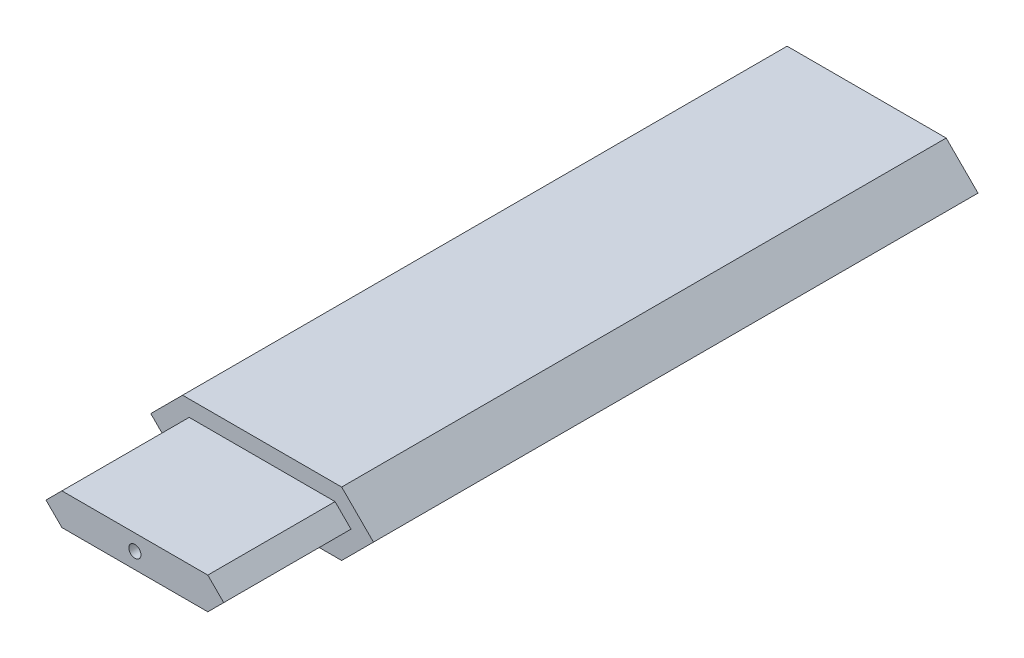
ISO-10303-21;
HEADER;
FILE_DESCRIPTION(('STEP AP214'),'2;1');
FILE_NAME('part.step','',(''),(''),'','','');
FILE_SCHEMA(('AUTOMOTIVE_DESIGN { 1 0 10303 214 1 1 1 1 }'));
ENDSEC;
DATA;
#1=APPLICATION_CONTEXT('core data for automotive mechanical design processes');
#2=APPLICATION_PROTOCOL_DEFINITION('international standard','automotive_design',2000,#1);
#3=PRODUCT_CONTEXT('',#1,'mechanical');
#4=PRODUCT('Part','Part','',(#3));
#5=PRODUCT_RELATED_PRODUCT_CATEGORY('part','',(#4));
#6=PRODUCT_DEFINITION_FORMATION('','',#4);
#7=PRODUCT_DEFINITION_CONTEXT('part definition',#1,'design');
#8=PRODUCT_DEFINITION('design','',#6,#7);
#9=PRODUCT_DEFINITION_SHAPE('','',#8);
#10=(LENGTH_UNIT() NAMED_UNIT(*) SI_UNIT(.MILLI.,.METRE.));
#11=(NAMED_UNIT(*) PLANE_ANGLE_UNIT() SI_UNIT($,.RADIAN.));
#12=(NAMED_UNIT(*) SI_UNIT($,.STERADIAN.) SOLID_ANGLE_UNIT());
#13=UNCERTAINTY_MEASURE_WITH_UNIT(LENGTH_MEASURE(1.E-05),#10,'distance_accuracy_value','');
#14=(GEOMETRIC_REPRESENTATION_CONTEXT(3) GLOBAL_UNCERTAINTY_ASSIGNED_CONTEXT((#13)) GLOBAL_UNIT_ASSIGNED_CONTEXT((#10,
#11,#12)) REPRESENTATION_CONTEXT('',''));
#15=CARTESIAN_POINT('',(0.,0.,0.));
#16=DIRECTION('',(0.,0.,1.));
#17=DIRECTION('',(1.,0.,0.));
#18=AXIS2_PLACEMENT_3D('',#15,#16,#17);
#19=CARTESIAN_POINT('',(0.,0.,-385.0001));
#20=DIRECTION('',(0.,0.,1.));
#21=DIRECTION('',(1.,0.,0.));
#22=AXIS2_PLACEMENT_3D('',#19,#20,#21);
#23=CYLINDRICAL_SURFACE('',#22,1.89999999999996);
#24=CARTESIAN_POINT('',(0.,0.,-155.));
#25=DIRECTION('',(0.,0.,1.));
#26=DIRECTION('',(1.,0.,0.));
#27=AXIS2_PLACEMENT_3D('',#24,#25,#26);
#28=CIRCLE('',#27,1.89999999999996);
#29=CARTESIAN_POINT('',(1.89999999999996,0.,-155.));
#30=VERTEX_POINT('',#29);
#31=EDGE_CURVE('E367',#30,#30,#28,.T.);
#32=ORIENTED_EDGE('',*,*,#31,.T.);
#33=EDGE_LOOP('',(#32));
#34=FACE_BOUND('',#33,.T.);
#35=CARTESIAN_POINT('',(0.,0.,-344.));
#36=DIRECTION('',(0.,0.,-1.));
#37=DIRECTION('',(-1.,0.,0.));
#38=AXIS2_PLACEMENT_3D('',#35,#36,#37);
#39=CIRCLE('',#38,1.89999999999996);
#40=CARTESIAN_POINT('',(-1.89999999999996,0.,-344.));
#41=VERTEX_POINT('',#40);
#42=EDGE_CURVE('E120',#41,#41,#39,.F.);
#43=ORIENTED_EDGE('',*,*,#42,.F.);
#44=EDGE_LOOP('',(#43));
#45=FACE_BOUND('',#44,.T.);
#46=ADVANCED_FACE('F115',(#34,#45),#23,.F.);
#47=CARTESIAN_POINT('',(17.5,-17.5,0.));
#48=DIRECTION('',(0.707106781186548,-0.707106781186547,0.));
#49=DIRECTION('',(-0.707106781186547,-0.707106781186548,0.));
#50=AXIS2_PLACEMENT_3D('',#47,#48,#49);
#51=PLANE('',#50);
#52=DIRECTION('',(0.,0.,-1.));
#53=VECTOR('',#52,1.);
#54=CARTESIAN_POINT('',(35.,0.,0.));
#55=LINE('',#54,#53);
#56=CARTESIAN_POINT('',(35.,0.,-195.));
#57=VERTEX_POINT('',#56);
#58=CARTESIAN_POINT('',(35.,0.,-385.));
#59=VERTEX_POINT('',#58);
#60=EDGE_CURVE('E484',#57,#59,#55,.T.);
#61=ORIENTED_EDGE('',*,*,#60,.F.);
#62=DIRECTION('',(-0.707106781186547,-0.707106781186548,0.));
#63=VECTOR('',#62,1.);
#64=CARTESIAN_POINT('',(17.5,-17.5,-195.));
#65=LINE('',#64,#63);
#66=CARTESIAN_POINT('',(25.,-10.,-195.));
#67=VERTEX_POINT('',#66);
#68=EDGE_CURVE('E357',#57,#67,#65,.T.);
#69=ORIENTED_EDGE('',*,*,#68,.T.);
#70=CARTESIAN_POINT('',(25.,-10.,-195.));
#71=DIRECTION('',(0.,0.,-1.));
#72=VECTOR('',#71,1.);
#73=LINE('',#70,#72);
#74=CARTESIAN_POINT('',(25.,-10.,-385.));
#75=VERTEX_POINT('',#74);
#76=EDGE_CURVE('E395',#67,#75,#73,.T.);
#77=ORIENTED_EDGE('',*,*,#76,.T.);
#78=DIRECTION('',(-0.707106781186547,-0.707106781186548,0.));
#79=VECTOR('',#78,1.);
#80=CARTESIAN_POINT('',(17.5,-17.5,-385.));
#81=LINE('',#80,#79);
#82=EDGE_CURVE('E385',#59,#75,#81,.T.);
#83=ORIENTED_EDGE('',*,*,#82,.F.);
#84=EDGE_LOOP('',(#61,#69,#77,#83));
#85=FACE_BOUND('',#84,.T.);
#86=ADVANCED_FACE('F417',(#85),#51,.T.);
#87=CARTESIAN_POINT('',(-17.5,-17.5,0.));
#88=DIRECTION('',(-0.707106781186548,-0.707106781186547,0.));
#89=DIRECTION('',(-0.707106781186547,0.707106781186548,0.));
#90=AXIS2_PLACEMENT_3D('',#87,#88,#89);
#91=PLANE('',#90);
#92=CARTESIAN_POINT('',(-25.,-10.,-385.));
#93=DIRECTION('',(0.,0.,1.));
#94=VECTOR('',#93,1.);
#95=LINE('',#92,#94);
#96=CARTESIAN_POINT('',(-25.,-10.,-385.));
#97=VERTEX_POINT('',#96);
#98=CARTESIAN_POINT('',(-25.,-10.,-195.));
#99=VERTEX_POINT('',#98);
#100=EDGE_CURVE('E494',#97,#99,#95,.T.);
#101=ORIENTED_EDGE('',*,*,#100,.T.);
#102=DIRECTION('',(-0.707106781186547,0.707106781186548,0.));
#103=VECTOR('',#102,1.);
#104=CARTESIAN_POINT('',(-17.5,-17.5,-195.));
#105=LINE('',#104,#103);
#106=CARTESIAN_POINT('',(-35.,0.,-195.));
#107=VERTEX_POINT('',#106);
#108=EDGE_CURVE('E352',#99,#107,#105,.T.);
#109=ORIENTED_EDGE('',*,*,#108,.T.);
#110=DIRECTION('',(0.,0.,1.));
#111=VECTOR('',#110,1.);
#112=CARTESIAN_POINT('',(-35.,0.,0.));
#113=LINE('',#112,#111);
#114=CARTESIAN_POINT('',(-35.,0.,-385.));
#115=VERTEX_POINT('',#114);
#116=EDGE_CURVE('E486',#115,#107,#113,.T.);
#117=ORIENTED_EDGE('',*,*,#116,.F.);
#118=DIRECTION('',(-0.707106781186547,0.707106781186548,0.));
#119=VECTOR('',#118,1.);
#120=CARTESIAN_POINT('',(-17.5,-17.5,-385.));
#121=LINE('',#120,#119);
#122=EDGE_CURVE('E380',#97,#115,#121,.T.);
#123=ORIENTED_EDGE('',*,*,#122,.F.);
#124=EDGE_LOOP('',(#101,#109,#117,#123));
#125=FACE_BOUND('',#124,.T.);
#126=ADVANCED_FACE('F407',(#125),#91,.T.);
#127=CARTESIAN_POINT('',(0.,-10.,0.));
#128=DIRECTION('',(0.,-1.,0.));
#129=DIRECTION('',(0.,0.,1.));
#130=AXIS2_PLACEMENT_3D('',#127,#128,#129);
#131=PLANE('',#130);
#132=ORIENTED_EDGE('',*,*,#76,.F.);
#133=DIRECTION('',(-1.,0.,0.));
#134=VECTOR('',#133,1.);
#135=CARTESIAN_POINT('',(0.,-10.,-195.));
#136=LINE('',#135,#134);
#137=EDGE_CURVE('E362',#67,#99,#136,.T.);
#138=ORIENTED_EDGE('',*,*,#137,.T.);
#139=ORIENTED_EDGE('',*,*,#100,.F.);
#140=DIRECTION('',(-1.,0.,0.));
#141=VECTOR('',#140,1.);
#142=CARTESIAN_POINT('',(0.,-10.,-385.));
#143=LINE('',#142,#141);
#144=EDGE_CURVE('E390',#75,#97,#143,.T.);
#145=ORIENTED_EDGE('',*,*,#144,.F.);
#146=EDGE_LOOP('',(#132,#138,#139,#145));
#147=FACE_BOUND('',#146,.T.);
#148=ADVANCED_FACE('F416',(#147),#131,.T.);
#149=CARTESIAN_POINT('',(-17.5,17.5,0.));
#150=DIRECTION('',(-0.707106781186548,0.707106781186547,0.));
#151=DIRECTION('',(-0.707106781186547,-0.707106781186548,0.));
#152=AXIS2_PLACEMENT_3D('',#149,#150,#151);
#153=PLANE('',#152);
#154=ORIENTED_EDGE('',*,*,#116,.T.);
#155=DIRECTION('',(0.707106781186547,0.707106781186548,0.));
#156=VECTOR('',#155,1.);
#157=CARTESIAN_POINT('',(-17.5,17.5,-195.));
#158=LINE('',#157,#156);
#159=CARTESIAN_POINT('',(-25.,10.,-195.));
#160=VERTEX_POINT('',#159);
#161=EDGE_CURVE('E347',#107,#160,#158,.T.);
#162=ORIENTED_EDGE('',*,*,#161,.T.);
#163=DIRECTION('',(0.,0.,1.));
#164=VECTOR('',#163,1.);
#165=CARTESIAN_POINT('',(-25.,10.,0.));
#166=LINE('',#165,#164);
#167=CARTESIAN_POINT('',(-25.,10.,-385.));
#168=VERTEX_POINT('',#167);
#169=EDGE_CURVE('E449',#168,#160,#166,.T.);
#170=ORIENTED_EDGE('',*,*,#169,.F.);
#171=DIRECTION('',(0.707106781186547,0.707106781186548,0.));
#172=VECTOR('',#171,1.);
#173=CARTESIAN_POINT('',(-17.5,17.5,-385.));
#174=LINE('',#173,#172);
#175=EDGE_CURVE('E375',#115,#168,#174,.T.);
#176=ORIENTED_EDGE('',*,*,#175,.F.);
#177=EDGE_LOOP('',(#154,#162,#170,#176));
#178=FACE_BOUND('',#177,.T.);
#179=ADVANCED_FACE('F117',(#178),#153,.T.);
#180=CARTESIAN_POINT('',(17.5,17.5,0.));
#181=DIRECTION('',(0.707106781186548,0.707106781186547,0.));
#182=DIRECTION('',(-0.707106781186547,0.707106781186548,0.));
#183=AXIS2_PLACEMENT_3D('',#180,#181,#182);
#184=PLANE('',#183);
#185=DIRECTION('',(0.,0.,-1.));
#186=VECTOR('',#185,1.);
#187=CARTESIAN_POINT('',(25.,10.,0.));
#188=LINE('',#187,#186);
#189=CARTESIAN_POINT('',(25.,10.,-195.));
#190=VERTEX_POINT('',#189);
#191=CARTESIAN_POINT('',(25.,10.,-385.));
#192=VERTEX_POINT('',#191);
#193=EDGE_CURVE('E479',#190,#192,#188,.T.);
#194=ORIENTED_EDGE('',*,*,#193,.F.);
#195=DIRECTION('',(0.707106781186547,-0.707106781186548,0.));
#196=VECTOR('',#195,1.);
#197=CARTESIAN_POINT('',(17.5,17.5,-195.));
#198=LINE('',#197,#196);
#199=EDGE_CURVE('E141',#190,#57,#198,.T.);
#200=ORIENTED_EDGE('',*,*,#199,.T.);
#201=ORIENTED_EDGE('',*,*,#60,.T.);
#202=DIRECTION('',(0.707106781186547,-0.707106781186548,0.));
#203=VECTOR('',#202,1.);
#204=CARTESIAN_POINT('',(17.5,17.5,-385.));
#205=LINE('',#204,#203);
#206=EDGE_CURVE('E372',#192,#59,#205,.T.);
#207=ORIENTED_EDGE('',*,*,#206,.F.);
#208=EDGE_LOOP('',(#194,#200,#201,#207));
#209=FACE_BOUND('',#208,.T.);
#210=ADVANCED_FACE('F425',(#209),#184,.T.);
#211=CARTESIAN_POINT('',(0.,10.,0.));
#212=DIRECTION('',(0.,1.,0.));
#213=DIRECTION('',(0.,0.,1.));
#214=AXIS2_PLACEMENT_3D('',#211,#212,#213);
#215=PLANE('',#214);
#216=ORIENTED_EDGE('',*,*,#169,.T.);
#217=DIRECTION('',(1.,0.,0.));
#218=VECTOR('',#217,1.);
#219=CARTESIAN_POINT('',(0.,10.,-195.));
#220=LINE('',#219,#218);
#221=EDGE_CURVE('E13',#160,#190,#220,.T.);
#222=ORIENTED_EDGE('',*,*,#221,.T.);
#223=ORIENTED_EDGE('',*,*,#193,.T.);
#224=DIRECTION('',(1.,0.,0.));
#225=VECTOR('',#224,1.);
#226=CARTESIAN_POINT('',(0.,10.,-385.));
#227=LINE('',#226,#225);
#228=EDGE_CURVE('E125',#168,#192,#227,.T.);
#229=ORIENTED_EDGE('',*,*,#228,.F.);
#230=EDGE_LOOP('',(#216,#222,#223,#229));
#231=FACE_BOUND('',#230,.T.);
#232=ADVANCED_FACE('F421',(#231),#215,.T.);
#233=CARTESIAN_POINT('',(0.,-22.5001,-155.));
#234=DIRECTION('',(0.,0.,1.));
#235=DIRECTION('',(1.,0.,0.));
#236=AXIS2_PLACEMENT_3D('',#233,#234,#235);
#237=PLANE('',#236);
#238=ORIENTED_EDGE('',*,*,#31,.F.);
#239=EDGE_LOOP('',(#238));
#240=FACE_BOUND('',#239,.T.);
#241=DIRECTION('',(-0.707106781186547,-0.707106781186548,0.));
#242=VECTOR('',#241,1.);
#243=CARTESIAN_POINT('',(-22.9289321881345,5.,-155.));
#244=LINE('',#243,#242);
#245=CARTESIAN_POINT('',(-22.9289321881345,5.,-155.));
#246=VERTEX_POINT('',#245);
#247=CARTESIAN_POINT('',(-27.9289321881345,0.,-155.));
#248=VERTEX_POINT('',#247);
#249=EDGE_CURVE('E301',#246,#248,#244,.T.);
#250=ORIENTED_EDGE('',*,*,#249,.T.);
#251=DIRECTION('',(0.707106781186548,-0.707106781186547,0.));
#252=VECTOR('',#251,1.);
#253=CARTESIAN_POINT('',(-27.9289321881345,0.,-155.));
#254=LINE('',#253,#252);
#255=CARTESIAN_POINT('',(-22.9289321881345,-5.,-155.));
#256=VERTEX_POINT('',#255);
#257=EDGE_CURVE('E317',#248,#256,#254,.T.);
#258=ORIENTED_EDGE('',*,*,#257,.T.);
#259=DIRECTION('',(1.,0.,0.));
#260=VECTOR('',#259,1.);
#261=CARTESIAN_POINT('',(-22.9289321881345,-5.,-155.));
#262=LINE('',#261,#260);
#263=CARTESIAN_POINT('',(22.9289321881345,-5.,-155.));
#264=VERTEX_POINT('',#263);
#265=EDGE_CURVE('E320',#256,#264,#262,.T.);
#266=ORIENTED_EDGE('',*,*,#265,.T.);
#267=DIRECTION('',(0.707106781186547,0.707106781186548,0.));
#268=VECTOR('',#267,1.);
#269=CARTESIAN_POINT('',(22.9289321881345,-5.,-155.));
#270=LINE('',#269,#268);
#271=CARTESIAN_POINT('',(27.9289321881345,0.,-155.));
#272=VERTEX_POINT('',#271);
#273=EDGE_CURVE('E323',#264,#272,#270,.T.);
#274=ORIENTED_EDGE('',*,*,#273,.T.);
#275=DIRECTION('',(-0.707106781186547,0.707106781186548,0.));
#276=VECTOR('',#275,1.);
#277=CARTESIAN_POINT('',(27.9289321881345,0.,-155.));
#278=LINE('',#277,#276);
#279=CARTESIAN_POINT('',(22.9289321881345,5.,-155.));
#280=VERTEX_POINT('',#279);
#281=EDGE_CURVE('E326',#272,#280,#278,.T.);
#282=ORIENTED_EDGE('',*,*,#281,.T.);
#283=DIRECTION('',(-1.,0.,0.));
#284=VECTOR('',#283,1.);
#285=CARTESIAN_POINT('',(22.9289321881345,5.,-155.));
#286=LINE('',#285,#284);
#287=EDGE_CURVE('E329',#280,#246,#286,.T.);
#288=ORIENTED_EDGE('',*,*,#287,.T.);
#289=EDGE_LOOP('',(#250,#258,#266,#274,#282,#288));
#290=FACE_BOUND('',#289,.T.);
#291=ADVANCED_FACE('F424',(#240,#290),#237,.T.);
#292=CARTESIAN_POINT('',(0.,-22.5001,-385.));
#293=DIRECTION('',(0.,0.,1.));
#294=DIRECTION('',(1.,0.,0.));
#295=AXIS2_PLACEMENT_3D('',#292,#293,#294);
#296=PLANE('',#295);
#297=DIRECTION('',(-0.707106781186547,-0.707106781186548,0.));
#298=VECTOR('',#297,1.);
#299=CARTESIAN_POINT('',(28.2117749006092,0.,-385.));
#300=LINE('',#299,#298);
#301=CARTESIAN_POINT('',(28.2117749006092,0.,-385.));
#302=VERTEX_POINT('',#301);
#303=CARTESIAN_POINT('',(23.0117749006092,-5.2,-385.));
#304=VERTEX_POINT('',#303);
#305=EDGE_CURVE('E278',#302,#304,#300,.T.);
#306=ORIENTED_EDGE('',*,*,#305,.F.);
#307=DIRECTION('',(0.707106781186547,-0.707106781186548,0.));
#308=VECTOR('',#307,1.);
#309=CARTESIAN_POINT('',(23.0117749006092,5.2,-385.));
#310=LINE('',#309,#308);
#311=CARTESIAN_POINT('',(23.0117749006092,5.2,-385.));
#312=VERTEX_POINT('',#311);
#313=EDGE_CURVE('E133',#312,#302,#310,.T.);
#314=ORIENTED_EDGE('',*,*,#313,.F.);
#315=DIRECTION('',(1.,0.,0.));
#316=VECTOR('',#315,1.);
#317=CARTESIAN_POINT('',(-23.0117749006092,5.2,-385.));
#318=LINE('',#317,#316);
#319=CARTESIAN_POINT('',(-23.0117749006092,5.2,-385.));
#320=VERTEX_POINT('',#319);
#321=EDGE_CURVE('E264',#320,#312,#318,.T.);
#322=ORIENTED_EDGE('',*,*,#321,.F.);
#323=DIRECTION('',(0.707106781186548,0.707106781186547,0.));
#324=VECTOR('',#323,1.);
#325=CARTESIAN_POINT('',(-28.2117749006092,0.,-385.));
#326=LINE('',#325,#324);
#327=CARTESIAN_POINT('',(-28.2117749006092,0.,-385.));
#328=VERTEX_POINT('',#327);
#329=EDGE_CURVE('E267',#328,#320,#326,.T.);
#330=ORIENTED_EDGE('',*,*,#329,.F.);
#331=DIRECTION('',(-0.707106781186548,0.707106781186548,0.));
#332=VECTOR('',#331,1.);
#333=CARTESIAN_POINT('',(-23.0117749006092,-5.2,-385.));
#334=LINE('',#333,#332);
#335=CARTESIAN_POINT('',(-23.0117749006092,-5.2,-385.));
#336=VERTEX_POINT('',#335);
#337=EDGE_CURVE('E283',#336,#328,#334,.T.);
#338=ORIENTED_EDGE('',*,*,#337,.F.);
#339=DIRECTION('',(-1.,0.,0.));
#340=VECTOR('',#339,1.);
#341=CARTESIAN_POINT('',(23.0117749006092,-5.2,-385.));
#342=LINE('',#341,#340);
#343=EDGE_CURVE('E280',#304,#336,#342,.T.);
#344=ORIENTED_EDGE('',*,*,#343,.F.);
#345=EDGE_LOOP('',(#306,#314,#322,#330,#338,#344));
#346=FACE_BOUND('',#345,.T.);
#347=ORIENTED_EDGE('',*,*,#82,.T.);
#348=ORIENTED_EDGE('',*,*,#144,.T.);
#349=ORIENTED_EDGE('',*,*,#122,.T.);
#350=ORIENTED_EDGE('',*,*,#175,.T.);
#351=ORIENTED_EDGE('',*,*,#228,.T.);
#352=ORIENTED_EDGE('',*,*,#206,.T.);
#353=EDGE_LOOP('',(#347,#348,#349,#350,#351,#352));
#354=FACE_BOUND('',#353,.T.);
#355=ADVANCED_FACE('F512',(#346,#354),#296,.F.);
#356=CARTESIAN_POINT('',(0.,0.,-195.));
#357=DIRECTION('',(0.,0.,1.));
#358=DIRECTION('',(1.,0.,0.));
#359=AXIS2_PLACEMENT_3D('',#356,#357,#358);
#360=PLANE('',#359);
#361=ORIENTED_EDGE('',*,*,#68,.F.);
#362=ORIENTED_EDGE('',*,*,#199,.F.);
#363=ORIENTED_EDGE('',*,*,#221,.F.);
#364=ORIENTED_EDGE('',*,*,#161,.F.);
#365=ORIENTED_EDGE('',*,*,#108,.F.);
#366=ORIENTED_EDGE('',*,*,#137,.F.);
#367=EDGE_LOOP('',(#361,#362,#363,#364,#365,#366));
#368=FACE_BOUND('',#367,.T.);
#369=DIRECTION('',(-0.707106781186547,-0.707106781186548,0.));
#370=VECTOR('',#369,1.);
#371=CARTESIAN_POINT('',(-22.9289321881345,5.,-195.));
#372=LINE('',#371,#370);
#373=CARTESIAN_POINT('',(-22.9289321881345,5.,-195.));
#374=VERTEX_POINT('',#373);
#375=CARTESIAN_POINT('',(-27.9289321881345,0.,-195.));
#376=VERTEX_POINT('',#375);
#377=EDGE_CURVE('E313',#374,#376,#372,.T.);
#378=ORIENTED_EDGE('',*,*,#377,.F.);
#379=DIRECTION('',(-1.,0.,0.));
#380=VECTOR('',#379,1.);
#381=CARTESIAN_POINT('',(22.9289321881345,5.,-195.));
#382=LINE('',#381,#380);
#383=CARTESIAN_POINT('',(22.9289321881345,5.,-195.));
#384=VERTEX_POINT('',#383);
#385=EDGE_CURVE('E310',#384,#374,#382,.T.);
#386=ORIENTED_EDGE('',*,*,#385,.F.);
#387=DIRECTION('',(-0.707106781186547,0.707106781186548,0.));
#388=VECTOR('',#387,1.);
#389=CARTESIAN_POINT('',(27.9289321881345,0.,-195.));
#390=LINE('',#389,#388);
#391=CARTESIAN_POINT('',(27.9289321881345,0.,-195.));
#392=VERTEX_POINT('',#391);
#393=EDGE_CURVE('E307',#392,#384,#390,.T.);
#394=ORIENTED_EDGE('',*,*,#393,.F.);
#395=DIRECTION('',(0.707106781186547,0.707106781186548,0.));
#396=VECTOR('',#395,1.);
#397=CARTESIAN_POINT('',(22.9289321881345,-5.,-195.));
#398=LINE('',#397,#396);
#399=CARTESIAN_POINT('',(22.9289321881345,-5.,-195.));
#400=VERTEX_POINT('',#399);
#401=EDGE_CURVE('E304',#400,#392,#398,.T.);
#402=ORIENTED_EDGE('',*,*,#401,.F.);
#403=DIRECTION('',(1.,0.,0.));
#404=VECTOR('',#403,1.);
#405=CARTESIAN_POINT('',(-22.9289321881345,-5.,-195.));
#406=LINE('',#405,#404);
#407=CARTESIAN_POINT('',(-22.9289321881345,-5.,-195.));
#408=VERTEX_POINT('',#407);
#409=EDGE_CURVE('E300',#408,#400,#406,.T.);
#410=ORIENTED_EDGE('',*,*,#409,.F.);
#411=DIRECTION('',(0.707106781186548,-0.707106781186547,0.));
#412=VECTOR('',#411,1.);
#413=CARTESIAN_POINT('',(-27.9289321881345,0.,-195.));
#414=LINE('',#413,#412);
#415=EDGE_CURVE('E297',#376,#408,#414,.T.);
#416=ORIENTED_EDGE('',*,*,#415,.F.);
#417=EDGE_LOOP('',(#378,#386,#394,#402,#410,#416));
#418=FACE_BOUND('',#417,.T.);
#419=ADVANCED_FACE('F516',(#368,#418),#360,.T.);
#420=CARTESIAN_POINT('',(-27.9289321881345,0.,-195.));
#421=DIRECTION('',(-0.707106781186547,-0.707106781186548,0.));
#422=DIRECTION('',(0.707106781186548,-0.707106781186547,0.));
#423=AXIS2_PLACEMENT_3D('',#420,#421,#422);
#424=PLANE('',#423);
#425=ORIENTED_EDGE('',*,*,#257,.F.);
#426=DIRECTION('',(0.,0.,1.));
#427=VECTOR('',#426,1.);
#428=CARTESIAN_POINT('',(-27.9289321881345,0.,-195.));
#429=LINE('',#428,#427);
#430=EDGE_CURVE('E334',#376,#248,#429,.T.);
#431=ORIENTED_EDGE('',*,*,#430,.F.);
#432=ORIENTED_EDGE('',*,*,#415,.T.);
#433=DIRECTION('',(0.,0.,1.));
#434=VECTOR('',#433,1.);
#435=CARTESIAN_POINT('',(-22.9289321881345,-5.,-195.));
#436=LINE('',#435,#434);
#437=EDGE_CURVE('E316',#408,#256,#436,.T.);
#438=ORIENTED_EDGE('',*,*,#437,.T.);
#439=EDGE_LOOP('',(#425,#431,#432,#438));
#440=FACE_BOUND('',#439,.T.);
#441=ADVANCED_FACE('F526',(#440),#424,.T.);
#442=CARTESIAN_POINT('',(-22.9289321881345,5.,-195.));
#443=DIRECTION('',(-0.707106781186548,0.707106781186547,0.));
#444=DIRECTION('',(-0.707106781186547,-0.707106781186548,0.));
#445=AXIS2_PLACEMENT_3D('',#442,#443,#444);
#446=PLANE('',#445);
#447=ORIENTED_EDGE('',*,*,#249,.F.);
#448=DIRECTION('',(0.,0.,1.));
#449=VECTOR('',#448,1.);
#450=CARTESIAN_POINT('',(-22.9289321881345,5.,-195.));
#451=LINE('',#450,#449);
#452=EDGE_CURVE('E336',#374,#246,#451,.T.);
#453=ORIENTED_EDGE('',*,*,#452,.F.);
#454=ORIENTED_EDGE('',*,*,#377,.T.);
#455=ORIENTED_EDGE('',*,*,#430,.T.);
#456=EDGE_LOOP('',(#447,#453,#454,#455));
#457=FACE_BOUND('',#456,.T.);
#458=ADVANCED_FACE('F529',(#457),#446,.T.);
#459=CARTESIAN_POINT('',(22.9289321881345,5.,-195.));
#460=DIRECTION('',(0.,1.,0.));
#461=DIRECTION('',(-1.,0.,0.));
#462=AXIS2_PLACEMENT_3D('',#459,#460,#461);
#463=PLANE('',#462);
#464=ORIENTED_EDGE('',*,*,#287,.F.);
#465=DIRECTION('',(0.,0.,1.));
#466=VECTOR('',#465,1.);
#467=CARTESIAN_POINT('',(22.9289321881345,5.,-195.));
#468=LINE('',#467,#466);
#469=EDGE_CURVE('E338',#384,#280,#468,.T.);
#470=ORIENTED_EDGE('',*,*,#469,.F.);
#471=ORIENTED_EDGE('',*,*,#385,.T.);
#472=ORIENTED_EDGE('',*,*,#452,.T.);
#473=EDGE_LOOP('',(#464,#470,#471,#472));
#474=FACE_BOUND('',#473,.T.);
#475=ADVANCED_FACE('F542',(#474),#463,.T.);
#476=CARTESIAN_POINT('',(27.9289321881345,0.,-195.));
#477=DIRECTION('',(0.707106781186548,0.707106781186547,0.));
#478=DIRECTION('',(-0.707106781186547,0.707106781186548,0.));
#479=AXIS2_PLACEMENT_3D('',#476,#477,#478);
#480=PLANE('',#479);
#481=ORIENTED_EDGE('',*,*,#281,.F.);
#482=DIRECTION('',(0.,0.,1.));
#483=VECTOR('',#482,1.);
#484=CARTESIAN_POINT('',(27.9289321881345,0.,-195.));
#485=LINE('',#484,#483);
#486=EDGE_CURVE('E340',#392,#272,#485,.T.);
#487=ORIENTED_EDGE('',*,*,#486,.F.);
#488=ORIENTED_EDGE('',*,*,#393,.T.);
#489=ORIENTED_EDGE('',*,*,#469,.T.);
#490=EDGE_LOOP('',(#481,#487,#488,#489));
#491=FACE_BOUND('',#490,.T.);
#492=ADVANCED_FACE('F538',(#491),#480,.T.);
#493=CARTESIAN_POINT('',(22.9289321881345,-5.,-195.));
#494=DIRECTION('',(0.707106781186548,-0.707106781186547,0.));
#495=DIRECTION('',(0.707106781186547,0.707106781186548,0.));
#496=AXIS2_PLACEMENT_3D('',#493,#494,#495);
#497=PLANE('',#496);
#498=ORIENTED_EDGE('',*,*,#273,.F.);
#499=DIRECTION('',(0.,0.,1.));
#500=VECTOR('',#499,1.);
#501=CARTESIAN_POINT('',(22.9289321881345,-5.,-195.));
#502=LINE('',#501,#500);
#503=EDGE_CURVE('E342',#400,#264,#502,.T.);
#504=ORIENTED_EDGE('',*,*,#503,.F.);
#505=ORIENTED_EDGE('',*,*,#401,.T.);
#506=ORIENTED_EDGE('',*,*,#486,.T.);
#507=EDGE_LOOP('',(#498,#504,#505,#506));
#508=FACE_BOUND('',#507,.T.);
#509=ADVANCED_FACE('F534',(#508),#497,.T.);
#510=CARTESIAN_POINT('',(-22.9289321881345,-5.,-195.));
#511=DIRECTION('',(0.,-1.,0.));
#512=DIRECTION('',(1.,0.,0.));
#513=AXIS2_PLACEMENT_3D('',#510,#511,#512);
#514=PLANE('',#513);
#515=ORIENTED_EDGE('',*,*,#265,.F.);
#516=ORIENTED_EDGE('',*,*,#437,.F.);
#517=ORIENTED_EDGE('',*,*,#409,.T.);
#518=ORIENTED_EDGE('',*,*,#503,.T.);
#519=EDGE_LOOP('',(#515,#516,#517,#518));
#520=FACE_BOUND('',#519,.T.);
#521=ADVANCED_FACE('F531',(#520),#514,.T.);
#522=CARTESIAN_POINT('',(0.,0.,-344.));
#523=DIRECTION('',(0.,0.,-1.));
#524=DIRECTION('',(-1.,0.,0.));
#525=AXIS2_PLACEMENT_3D('',#522,#523,#524);
#526=PLANE('',#525);
#527=DIRECTION('',(0.707106781186547,-0.707106781186548,0.));
#528=VECTOR('',#527,1.);
#529=CARTESIAN_POINT('',(23.0117749006092,5.2,-344.));
#530=LINE('',#529,#528);
#531=CARTESIAN_POINT('',(23.0117749006092,5.2,-344.));
#532=VERTEX_POINT('',#531);
#533=CARTESIAN_POINT('',(28.2117749006092,0.,-344.));
#534=VERTEX_POINT('',#533);
#535=EDGE_CURVE('E244',#532,#534,#530,.T.);
#536=ORIENTED_EDGE('',*,*,#535,.T.);
#537=DIRECTION('',(-0.707106781186547,-0.707106781186548,0.));
#538=VECTOR('',#537,1.);
#539=CARTESIAN_POINT('',(28.2117749006092,0.,-344.));
#540=LINE('',#539,#538);
#541=CARTESIAN_POINT('',(23.0117749006092,-5.2,-344.));
#542=VERTEX_POINT('',#541);
#543=EDGE_CURVE('E253',#534,#542,#540,.T.);
#544=ORIENTED_EDGE('',*,*,#543,.T.);
#545=DIRECTION('',(-1.,0.,0.));
#546=VECTOR('',#545,1.);
#547=CARTESIAN_POINT('',(23.0117749006092,-5.2,-344.));
#548=LINE('',#547,#546);
#549=CARTESIAN_POINT('',(-23.0117749006092,-5.2,-344.));
#550=VERTEX_POINT('',#549);
#551=EDGE_CURVE('E258',#542,#550,#548,.T.);
#552=ORIENTED_EDGE('',*,*,#551,.T.);
#553=DIRECTION('',(-0.707106781186548,0.707106781186548,0.));
#554=VECTOR('',#553,1.);
#555=CARTESIAN_POINT('',(-23.0117749006092,-5.2,-344.));
#556=LINE('',#555,#554);
#557=CARTESIAN_POINT('',(-28.2117749006092,0.,-344.));
#558=VERTEX_POINT('',#557);
#559=EDGE_CURVE('E271',#550,#558,#556,.T.);
#560=ORIENTED_EDGE('',*,*,#559,.T.);
#561=DIRECTION('',(0.707106781186548,0.707106781186547,0.));
#562=VECTOR('',#561,1.);
#563=CARTESIAN_POINT('',(-28.2117749006092,0.,-344.));
#564=LINE('',#563,#562);
#565=CARTESIAN_POINT('',(-23.0117749006092,5.2,-344.));
#566=VERTEX_POINT('',#565);
#567=EDGE_CURVE('E274',#558,#566,#564,.T.);
#568=ORIENTED_EDGE('',*,*,#567,.T.);
#569=DIRECTION('',(1.,0.,0.));
#570=VECTOR('',#569,1.);
#571=CARTESIAN_POINT('',(-23.0117749006092,5.2,-344.));
#572=LINE('',#571,#570);
#573=EDGE_CURVE('E250',#566,#532,#572,.T.);
#574=ORIENTED_EDGE('',*,*,#573,.T.);
#575=EDGE_LOOP('',(#536,#544,#552,#560,#568,#574));
#576=FACE_BOUND('',#575,.T.);
#577=ORIENTED_EDGE('',*,*,#42,.T.);
#578=EDGE_LOOP('',(#577));
#579=FACE_BOUND('',#578,.T.);
#580=ADVANCED_FACE('F260',(#576,#579),#526,.T.);
#581=CARTESIAN_POINT('',(23.0117749006092,5.2,-344.));
#582=DIRECTION('',(0.707106781186548,0.707106781186547,0.));
#583=DIRECTION('',(-0.707106781186547,0.707106781186548,0.));
#584=AXIS2_PLACEMENT_3D('',#581,#582,#583);
#585=PLANE('',#584);
#586=ORIENTED_EDGE('',*,*,#313,.T.);
#587=DIRECTION('',(0.,0.,-1.));
#588=VECTOR('',#587,1.);
#589=CARTESIAN_POINT('',(28.2117749006092,0.,-344.));
#590=LINE('',#589,#588);
#591=EDGE_CURVE('E240',#534,#302,#590,.T.);
#592=ORIENTED_EDGE('',*,*,#591,.F.);
#593=ORIENTED_EDGE('',*,*,#535,.F.);
#594=DIRECTION('',(0.,0.,-1.));
#595=VECTOR('',#594,1.);
#596=CARTESIAN_POINT('',(23.0117749006092,5.2,-344.));
#597=LINE('',#596,#595);
#598=EDGE_CURVE('E288',#532,#312,#597,.T.);
#599=ORIENTED_EDGE('',*,*,#598,.T.);
#600=EDGE_LOOP('',(#586,#592,#593,#599));
#601=FACE_BOUND('',#600,.T.);
#602=ADVANCED_FACE('F242',(#601),#585,.F.);
#603=CARTESIAN_POINT('',(-23.0117749006092,5.2,-344.));
#604=DIRECTION('',(0.,1.,0.));
#605=DIRECTION('',(-1.,0.,0.));
#606=AXIS2_PLACEMENT_3D('',#603,#604,#605);
#607=PLANE('',#606);
#608=ORIENTED_EDGE('',*,*,#321,.T.);
#609=ORIENTED_EDGE('',*,*,#598,.F.);
#610=ORIENTED_EDGE('',*,*,#573,.F.);
#611=DIRECTION('',(0.,0.,-1.));
#612=VECTOR('',#611,1.);
#613=CARTESIAN_POINT('',(-23.0117749006092,5.2,-344.));
#614=LINE('',#613,#612);
#615=EDGE_CURVE('E290',#566,#320,#614,.T.);
#616=ORIENTED_EDGE('',*,*,#615,.T.);
#617=EDGE_LOOP('',(#608,#609,#610,#616));
#618=FACE_BOUND('',#617,.T.);
#619=ADVANCED_FACE('F552',(#618),#607,.F.);
#620=CARTESIAN_POINT('',(-28.2117749006092,0.,-344.));
#621=DIRECTION('',(-0.707106781186547,0.707106781186548,0.));
#622=DIRECTION('',(-0.707106781186548,-0.707106781186547,0.));
#623=AXIS2_PLACEMENT_3D('',#620,#621,#622);
#624=PLANE('',#623);
#625=ORIENTED_EDGE('',*,*,#329,.T.);
#626=ORIENTED_EDGE('',*,*,#615,.F.);
#627=ORIENTED_EDGE('',*,*,#567,.F.);
#628=DIRECTION('',(0.,0.,-1.));
#629=VECTOR('',#628,1.);
#630=CARTESIAN_POINT('',(-28.2117749006092,0.,-344.));
#631=LINE('',#630,#629);
#632=EDGE_CURVE('E292',#558,#328,#631,.T.);
#633=ORIENTED_EDGE('',*,*,#632,.T.);
#634=EDGE_LOOP('',(#625,#626,#627,#633));
#635=FACE_BOUND('',#634,.T.);
#636=ADVANCED_FACE('F562',(#635),#624,.F.);
#637=CARTESIAN_POINT('',(-23.0117749006092,-5.2,-344.));
#638=DIRECTION('',(-0.707106781186547,-0.707106781186547,0.));
#639=DIRECTION('',(0.707106781186548,-0.707106781186548,0.));
#640=AXIS2_PLACEMENT_3D('',#637,#638,#639);
#641=PLANE('',#640);
#642=ORIENTED_EDGE('',*,*,#337,.T.);
#643=ORIENTED_EDGE('',*,*,#632,.F.);
#644=ORIENTED_EDGE('',*,*,#559,.F.);
#645=DIRECTION('',(0.,0.,-1.));
#646=VECTOR('',#645,1.);
#647=CARTESIAN_POINT('',(-23.0117749006092,-5.2,-344.));
#648=LINE('',#647,#646);
#649=EDGE_CURVE('E294',#550,#336,#648,.T.);
#650=ORIENTED_EDGE('',*,*,#649,.T.);
#651=EDGE_LOOP('',(#642,#643,#644,#650));
#652=FACE_BOUND('',#651,.T.);
#653=ADVANCED_FACE('F558',(#652),#641,.F.);
#654=CARTESIAN_POINT('',(23.0117749006092,-5.2,-344.));
#655=DIRECTION('',(0.,-1.,0.));
#656=DIRECTION('',(1.,0.,0.));
#657=AXIS2_PLACEMENT_3D('',#654,#655,#656);
#658=PLANE('',#657);
#659=ORIENTED_EDGE('',*,*,#343,.T.);
#660=ORIENTED_EDGE('',*,*,#649,.F.);
#661=ORIENTED_EDGE('',*,*,#551,.F.);
#662=DIRECTION('',(0.,0.,-1.));
#663=VECTOR('',#662,1.);
#664=CARTESIAN_POINT('',(23.0117749006092,-5.2,-344.));
#665=LINE('',#664,#663);
#666=EDGE_CURVE('E249',#542,#304,#665,.T.);
#667=ORIENTED_EDGE('',*,*,#666,.T.);
#668=EDGE_LOOP('',(#659,#660,#661,#667));
#669=FACE_BOUND('',#668,.T.);
#670=ADVANCED_FACE('F555',(#669),#658,.F.);
#671=CARTESIAN_POINT('',(28.2117749006092,0.,-344.));
#672=DIRECTION('',(0.707106781186548,-0.707106781186547,0.));
#673=DIRECTION('',(0.707106781186547,0.707106781186548,0.));
#674=AXIS2_PLACEMENT_3D('',#671,#672,#673);
#675=PLANE('',#674);
#676=ORIENTED_EDGE('',*,*,#305,.T.);
#677=ORIENTED_EDGE('',*,*,#666,.F.);
#678=ORIENTED_EDGE('',*,*,#543,.F.);
#679=ORIENTED_EDGE('',*,*,#591,.T.);
#680=EDGE_LOOP('',(#676,#677,#678,#679));
#681=FACE_BOUND('',#680,.T.);
#682=ADVANCED_FACE('F254',(#681),#675,.F.);
#683=CLOSED_SHELL('',(#46,#86,#126,#148,#179,#210,#232,#291,#355,#419,#441,#458,#475,#492,#509,
#521,#580,#602,#619,#636,#653,#670,#682));
#684=MANIFOLD_SOLID_BREP('B2',#683);
#685=ADVANCED_BREP_SHAPE_REPRESENTATION('',(#18,#684),#14);
#686=SHAPE_DEFINITION_REPRESENTATION(#9,#685);
ENDSEC;
END-ISO-10303-21;
